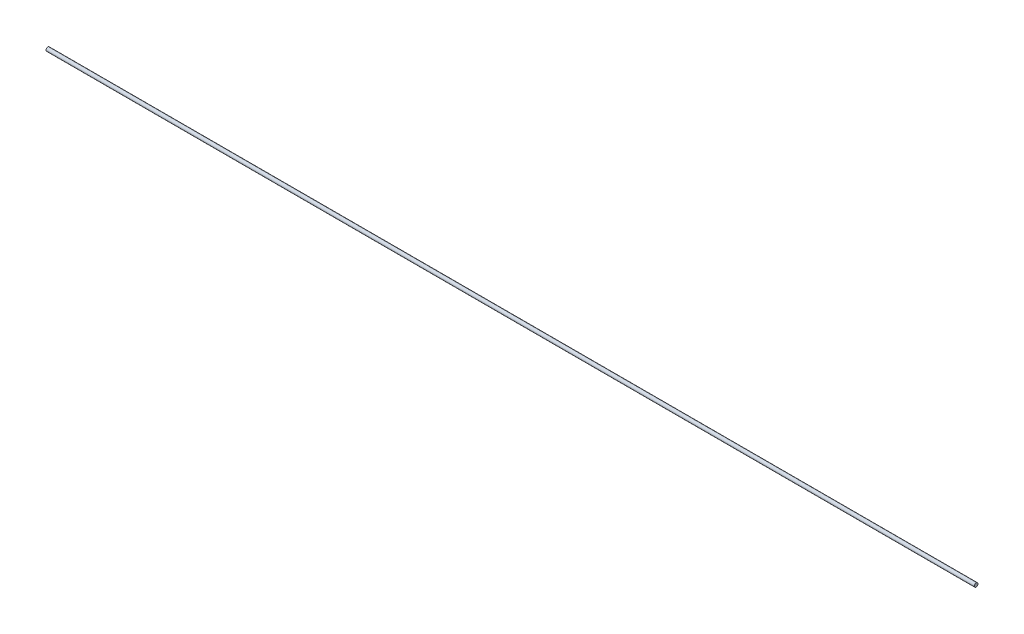
ISO-10303-21;
HEADER;
FILE_DESCRIPTION(('STEP AP214'),'2;1');
FILE_NAME('part.step','',(''),(''),'','','');
FILE_SCHEMA(('AUTOMOTIVE_DESIGN { 1 0 10303 214 1 1 1 1 }'));
ENDSEC;
DATA;
#1=APPLICATION_CONTEXT('core data for automotive mechanical design processes');
#2=APPLICATION_PROTOCOL_DEFINITION('international standard','automotive_design',2000,#1);
#3=PRODUCT_CONTEXT('',#1,'mechanical');
#4=PRODUCT('Part','Part','',(#3));
#5=PRODUCT_RELATED_PRODUCT_CATEGORY('part','',(#4));
#6=PRODUCT_DEFINITION_FORMATION('','',#4);
#7=PRODUCT_DEFINITION_CONTEXT('part definition',#1,'design');
#8=PRODUCT_DEFINITION('design','',#6,#7);
#9=PRODUCT_DEFINITION_SHAPE('','',#8);
#10=(LENGTH_UNIT() NAMED_UNIT(*) SI_UNIT(.MILLI.,.METRE.));
#11=(NAMED_UNIT(*) PLANE_ANGLE_UNIT() SI_UNIT($,.RADIAN.));
#12=(NAMED_UNIT(*) SI_UNIT($,.STERADIAN.) SOLID_ANGLE_UNIT());
#13=UNCERTAINTY_MEASURE_WITH_UNIT(LENGTH_MEASURE(1.E-05),#10,'distance_accuracy_value','');
#14=(GEOMETRIC_REPRESENTATION_CONTEXT(3) GLOBAL_UNCERTAINTY_ASSIGNED_CONTEXT((#13)) GLOBAL_UNIT_ASSIGNED_CONTEXT((#10,
#11,#12)) REPRESENTATION_CONTEXT('',''));
#15=CARTESIAN_POINT('',(0.,0.,0.));
#16=DIRECTION('',(0.,0.,1.));
#17=DIRECTION('',(1.,0.,0.));
#18=AXIS2_PLACEMENT_3D('',#15,#16,#17);
#19=CARTESIAN_POINT('',(1593.85,0.,0.));
#20=DIRECTION('',(-1.,0.,0.));
#21=DIRECTION('',(0.,0.,1.));
#22=AXIS2_PLACEMENT_3D('',#19,#20,#21);
#23=CYLINDRICAL_SURFACE('',#22,3.175);
#24=CARTESIAN_POINT('',(1593.85,0.,0.));
#25=DIRECTION('',(1.,0.,0.));
#26=DIRECTION('',(0.,0.,-1.));
#27=AXIS2_PLACEMENT_3D('',#24,#25,#26);
#28=CIRCLE('',#27,3.175);
#29=CARTESIAN_POINT('',(1593.85,0.,3.175));
#30=VERTEX_POINT('',#29);
#31=EDGE_CURVE('E10',#30,#30,#28,.T.);
#32=CARTESIAN_POINT('',(0.,0.,0.));
#33=DIRECTION('',(1.,0.,0.));
#34=DIRECTION('',(0.,0.,-1.));
#35=AXIS2_PLACEMENT_3D('',#32,#33,#34);
#36=CIRCLE('',#35,3.175);
#37=CARTESIAN_POINT('',(0.,0.,3.175));
#38=VERTEX_POINT('',#37);
#39=EDGE_CURVE('E39',#38,#38,#36,.T.);
#40=CARTESIAN_POINT('',(1593.85,0.,3.175));
#41=CARTESIAN_POINT('',(1577.24739583333,0.,3.175));
#42=CARTESIAN_POINT('',(1560.64479166667,0.,3.175));
#43=CARTESIAN_POINT('',(1527.43958333333,0.,3.175));
#44=CARTESIAN_POINT('',(1510.83697916667,0.,3.175));
#45=CARTESIAN_POINT('',(1477.63177083333,0.,3.175));
#46=CARTESIAN_POINT('',(1461.02916666667,0.,3.175));
#47=CARTESIAN_POINT('',(1427.82395833333,0.,3.175));
#48=CARTESIAN_POINT('',(1411.22135416667,0.,3.175));
#49=CARTESIAN_POINT('',(1378.01614583333,0.,3.175));
#50=CARTESIAN_POINT('',(1361.41354166667,0.,3.175));
#51=CARTESIAN_POINT('',(1328.20833333333,0.,3.175));
#52=CARTESIAN_POINT('',(1311.60572916667,0.,3.175));
#53=CARTESIAN_POINT('',(1278.40052083333,0.,3.175));
#54=CARTESIAN_POINT('',(1261.79791666667,0.,3.175));
#55=CARTESIAN_POINT('',(1228.59270833333,0.,3.175));
#56=CARTESIAN_POINT('',(1211.99010416667,0.,3.175));
#57=CARTESIAN_POINT('',(1178.78489583333,0.,3.175));
#58=CARTESIAN_POINT('',(1162.18229166667,0.,3.175));
#59=CARTESIAN_POINT('',(1128.97708333333,0.,3.175));
#60=CARTESIAN_POINT('',(1112.37447916667,0.,3.175));
#61=CARTESIAN_POINT('',(1079.16927083333,0.,3.175));
#62=CARTESIAN_POINT('',(1062.56666666667,0.,3.175));
#63=CARTESIAN_POINT('',(1029.36145833333,0.,3.175));
#64=CARTESIAN_POINT('',(1012.75885416667,0.,3.175));
#65=CARTESIAN_POINT('',(979.553645833333,0.,3.175));
#66=CARTESIAN_POINT('',(962.951041666667,0.,3.175));
#67=CARTESIAN_POINT('',(929.745833333333,0.,3.175));
#68=CARTESIAN_POINT('',(913.143229166667,0.,3.175));
#69=CARTESIAN_POINT('',(879.938020833333,0.,3.175));
#70=CARTESIAN_POINT('',(863.335416666667,0.,3.175));
#71=CARTESIAN_POINT('',(830.130208333333,0.,3.175));
#72=CARTESIAN_POINT('',(813.527604166667,0.,3.175));
#73=CARTESIAN_POINT('',(780.322395833333,0.,3.175));
#74=CARTESIAN_POINT('',(763.719791666667,0.,3.175));
#75=CARTESIAN_POINT('',(730.514583333333,0.,3.175));
#76=CARTESIAN_POINT('',(713.911979166667,0.,3.175));
#77=CARTESIAN_POINT('',(680.706770833333,0.,3.175));
#78=CARTESIAN_POINT('',(664.104166666667,0.,3.175));
#79=CARTESIAN_POINT('',(630.898958333333,0.,3.175));
#80=CARTESIAN_POINT('',(614.296354166667,0.,3.175));
#81=CARTESIAN_POINT('',(581.091145833333,0.,3.175));
#82=CARTESIAN_POINT('',(564.488541666667,0.,3.175));
#83=CARTESIAN_POINT('',(531.283333333333,0.,3.175));
#84=CARTESIAN_POINT('',(514.680729166667,0.,3.175));
#85=CARTESIAN_POINT('',(481.475520833333,0.,3.175));
#86=CARTESIAN_POINT('',(464.872916666667,0.,3.175));
#87=CARTESIAN_POINT('',(431.667708333333,0.,3.175));
#88=CARTESIAN_POINT('',(415.065104166667,0.,3.175));
#89=CARTESIAN_POINT('',(381.859895833333,0.,3.175));
#90=CARTESIAN_POINT('',(365.257291666667,0.,3.175));
#91=CARTESIAN_POINT('',(332.052083333333,0.,3.175));
#92=CARTESIAN_POINT('',(315.449479166667,0.,3.175));
#93=CARTESIAN_POINT('',(282.244270833333,0.,3.175));
#94=CARTESIAN_POINT('',(265.641666666667,0.,3.175));
#95=CARTESIAN_POINT('',(232.436458333333,0.,3.175));
#96=CARTESIAN_POINT('',(215.833854166667,0.,3.175));
#97=CARTESIAN_POINT('',(182.628645833333,0.,3.175));
#98=CARTESIAN_POINT('',(166.026041666667,0.,3.175));
#99=CARTESIAN_POINT('',(132.820833333333,0.,3.175));
#100=CARTESIAN_POINT('',(116.218229166667,0.,3.175));
#101=CARTESIAN_POINT('',(83.0130208333334,0.,3.175));
#102=CARTESIAN_POINT('',(66.4104166666667,0.,3.175));
#103=CARTESIAN_POINT('',(33.2052083333334,0.,3.175));
#104=CARTESIAN_POINT('',(16.6026041666667,0.,3.175));
#105=CARTESIAN_POINT('',(0.,0.,3.175));
#106=B_SPLINE_CURVE_WITH_KNOTS('',3,(#40,#41,#42,#43,#44,#45,#46,#47,#48,#49,#50,#51,#52,#53,
#54,#55,#56,#57,#58,#59,#60,#61,#62,#63,#64,#65,#66,#67,#68,#69,#70,#71,#72,#73,#74,#75,#76,#77,
#78,#79,#80,#81,#82,#83,#84,#85,#86,#87,#88,#89,#90,#91,#92,#93,#94,#95,#96,#97,#98,#99,#100,
#101,#102,#103,#104,#105),.UNSPECIFIED.,.F.,.F.,(4,2,2,2,2,2,2,2,2,2,2,2,2,2,2,2,2,2,2,2,2,2,2,
2,2,2,2,2,2,2,2,2,4),(0.,49.8078124999999,99.6156249999998,149.4234375,199.23125,249.0390625,
298.846875,348.6546875,398.4625,448.2703125,498.078125,547.8859375,597.69375,647.5015625,
697.309375,747.1171875,796.925,846.7328125,896.540625,946.3484375,996.15625,1045.9640625,
1095.771875,1145.5796875,1195.3875,1245.1953125,1295.003125,1344.8109375,1394.61875,
1444.4265625,1494.234375,1544.0421875,1593.85),.UNSPECIFIED.);
#107=EDGE_CURVE('BSEAM36',#30,#38,#106,.T.);
#108=ORIENTED_EDGE('',*,*,#31,.F.);
#109=ORIENTED_EDGE('',*,*,#39,.T.);
#110=ORIENTED_EDGE('',*,*,#107,.T.);
#111=ORIENTED_EDGE('',*,*,#107,.F.);
#112=EDGE_LOOP('',(#108,#110,#109,#111));
#113=FACE_BOUND('',#112,.T.);
#114=ADVANCED_FACE('F36',(#113),#23,.T.);
#115=CARTESIAN_POINT('',(1593.85,0.,0.));
#116=DIRECTION('',(1.,0.,0.));
#117=DIRECTION('',(0.,0.,-1.));
#118=AXIS2_PLACEMENT_3D('',#115,#116,#117);
#119=PLANE('',#118);
#120=ORIENTED_EDGE('',*,*,#31,.T.);
#121=EDGE_LOOP('',(#120));
#122=FACE_BOUND('',#121,.T.);
#123=ADVANCED_FACE('F51',(#122),#119,.T.);
#124=CARTESIAN_POINT('',(0.,0.,0.));
#125=DIRECTION('',(1.,0.,0.));
#126=DIRECTION('',(0.,0.,-1.));
#127=AXIS2_PLACEMENT_3D('',#124,#125,#126);
#128=PLANE('',#127);
#129=ORIENTED_EDGE('',*,*,#39,.F.);
#130=EDGE_LOOP('',(#129));
#131=FACE_BOUND('',#130,.T.);
#132=ADVANCED_FACE('F49',(#131),#128,.F.);
#133=CLOSED_SHELL('',(#114,#123,#132));
#134=MANIFOLD_SOLID_BREP('B2',#133);
#135=ADVANCED_BREP_SHAPE_REPRESENTATION('',(#18,#134),#14);
#136=SHAPE_DEFINITION_REPRESENTATION(#9,#135);
ENDSEC;
END-ISO-10303-21;
